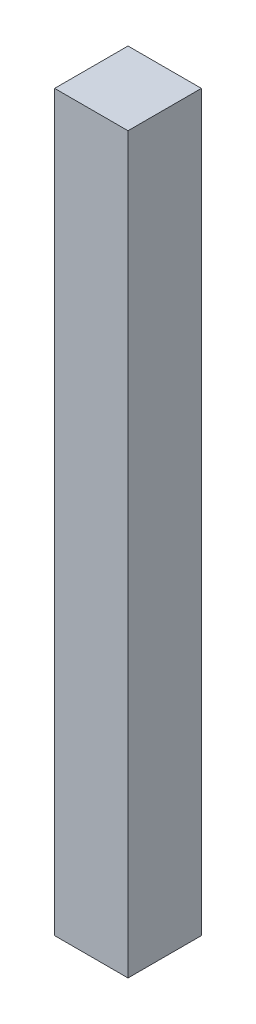
ISO-10303-21;
HEADER;
FILE_DESCRIPTION(('STEP AP214'),'2;1');
FILE_NAME('part.step','',(''),(''),'','','');
FILE_SCHEMA(('AUTOMOTIVE_DESIGN { 1 0 10303 214 1 1 1 1 }'));
ENDSEC;
DATA;
#1=APPLICATION_CONTEXT('core data for automotive mechanical design processes');
#2=APPLICATION_PROTOCOL_DEFINITION('international standard','automotive_design',2000,#1);
#3=PRODUCT_CONTEXT('',#1,'mechanical');
#4=PRODUCT('Part','Part','',(#3));
#5=PRODUCT_RELATED_PRODUCT_CATEGORY('part','',(#4));
#6=PRODUCT_DEFINITION_FORMATION('','',#4);
#7=PRODUCT_DEFINITION_CONTEXT('part definition',#1,'design');
#8=PRODUCT_DEFINITION('design','',#6,#7);
#9=PRODUCT_DEFINITION_SHAPE('','',#8);
#10=(LENGTH_UNIT() NAMED_UNIT(*) SI_UNIT(.MILLI.,.METRE.));
#11=(NAMED_UNIT(*) PLANE_ANGLE_UNIT() SI_UNIT($,.RADIAN.));
#12=(NAMED_UNIT(*) SI_UNIT($,.STERADIAN.) SOLID_ANGLE_UNIT());
#13=UNCERTAINTY_MEASURE_WITH_UNIT(LENGTH_MEASURE(1.E-05),#10,'distance_accuracy_value','');
#14=(GEOMETRIC_REPRESENTATION_CONTEXT(3) GLOBAL_UNCERTAINTY_ASSIGNED_CONTEXT((#13)) GLOBAL_UNIT_ASSIGNED_CONTEXT((#10,
#11,#12)) REPRESENTATION_CONTEXT('',''));
#15=CARTESIAN_POINT('',(0.,0.,0.));
#16=DIRECTION('',(0.,0.,1.));
#17=DIRECTION('',(1.,0.,0.));
#18=AXIS2_PLACEMENT_3D('',#15,#16,#17);
#19=CARTESIAN_POINT('',(10.,200.,10.));
#20=DIRECTION('',(-1.,0.,0.));
#21=DIRECTION('',(0.,0.,1.));
#22=AXIS2_PLACEMENT_3D('',#19,#20,#21);
#23=PLANE('',#22);
#24=DIRECTION('',(0.,0.,-1.));
#25=VECTOR('',#24,1.);
#26=CARTESIAN_POINT('',(10.,0.,10.));
#27=LINE('',#26,#25);
#28=CARTESIAN_POINT('',(10.,0.,10.));
#29=VERTEX_POINT('',#28);
#30=CARTESIAN_POINT('',(10.,0.,-10.));
#31=VERTEX_POINT('',#30);
#32=EDGE_CURVE('E104',#29,#31,#27,.T.);
#33=ORIENTED_EDGE('',*,*,#32,.T.);
#34=DIRECTION('',(0.,-1.,0.));
#35=VECTOR('',#34,1.);
#36=CARTESIAN_POINT('',(10.,200.,-10.));
#37=LINE('',#36,#35);
#38=CARTESIAN_POINT('',(10.,200.,-10.));
#39=VERTEX_POINT('',#38);
#40=EDGE_CURVE('E11',#39,#31,#37,.T.);
#41=ORIENTED_EDGE('',*,*,#40,.F.);
#42=DIRECTION('',(0.,0.,-1.));
#43=VECTOR('',#42,1.);
#44=CARTESIAN_POINT('',(10.,200.,10.));
#45=LINE('',#44,#43);
#46=CARTESIAN_POINT('',(10.,200.,10.));
#47=VERTEX_POINT('',#46);
#48=EDGE_CURVE('E92',#47,#39,#45,.T.);
#49=ORIENTED_EDGE('',*,*,#48,.F.);
#50=DIRECTION('',(0.,-1.,0.));
#51=VECTOR('',#50,1.);
#52=CARTESIAN_POINT('',(10.,200.,10.));
#53=LINE('',#52,#51);
#54=EDGE_CURVE('E100',#47,#29,#53,.T.);
#55=ORIENTED_EDGE('',*,*,#54,.T.);
#56=EDGE_LOOP('',(#33,#41,#49,#55));
#57=FACE_BOUND('',#56,.T.);
#58=ADVANCED_FACE('F41',(#57),#23,.F.);
#59=CARTESIAN_POINT('',(-10.,200.,-10.));
#60=DIRECTION('',(0.,0.,1.));
#61=DIRECTION('',(1.,0.,0.));
#62=AXIS2_PLACEMENT_3D('',#59,#60,#61);
#63=PLANE('',#62);
#64=DIRECTION('',(-1.,0.,0.));
#65=VECTOR('',#64,1.);
#66=CARTESIAN_POINT('',(-10.,0.,-10.));
#67=LINE('',#66,#65);
#68=CARTESIAN_POINT('',(-10.,0.,-10.));
#69=VERTEX_POINT('',#68);
#70=EDGE_CURVE('E96',#31,#69,#67,.T.);
#71=ORIENTED_EDGE('',*,*,#70,.T.);
#72=DIRECTION('',(0.,-1.,0.));
#73=VECTOR('',#72,1.);
#74=CARTESIAN_POINT('',(-10.,200.,-10.));
#75=LINE('',#74,#73);
#76=CARTESIAN_POINT('',(-10.,200.,-10.));
#77=VERTEX_POINT('',#76);
#78=EDGE_CURVE('E49',#77,#69,#75,.T.);
#79=ORIENTED_EDGE('',*,*,#78,.F.);
#80=DIRECTION('',(-1.,0.,0.));
#81=VECTOR('',#80,1.);
#82=CARTESIAN_POINT('',(-10.,200.,-10.));
#83=LINE('',#82,#81);
#84=EDGE_CURVE('E87',#39,#77,#83,.T.);
#85=ORIENTED_EDGE('',*,*,#84,.F.);
#86=ORIENTED_EDGE('',*,*,#40,.T.);
#87=EDGE_LOOP('',(#71,#79,#85,#86));
#88=FACE_BOUND('',#87,.T.);
#89=ADVANCED_FACE('F95',(#88),#63,.F.);
#90=CARTESIAN_POINT('',(-10.,200.,10.));
#91=DIRECTION('',(1.,0.,0.));
#92=DIRECTION('',(0.,0.,-1.));
#93=AXIS2_PLACEMENT_3D('',#90,#91,#92);
#94=PLANE('',#93);
#95=DIRECTION('',(0.,0.,1.));
#96=VECTOR('',#95,1.);
#97=CARTESIAN_POINT('',(-10.,0.,10.));
#98=LINE('',#97,#96);
#99=CARTESIAN_POINT('',(-10.,0.,10.));
#100=VERTEX_POINT('',#99);
#101=EDGE_CURVE('E74',#69,#100,#98,.T.);
#102=ORIENTED_EDGE('',*,*,#101,.T.);
#103=DIRECTION('',(0.,-1.,0.));
#104=VECTOR('',#103,1.);
#105=CARTESIAN_POINT('',(-10.,200.,10.));
#106=LINE('',#105,#104);
#107=CARTESIAN_POINT('',(-10.,200.,10.));
#108=VERTEX_POINT('',#107);
#109=EDGE_CURVE('E97',#108,#100,#106,.T.);
#110=ORIENTED_EDGE('',*,*,#109,.F.);
#111=DIRECTION('',(0.,0.,1.));
#112=VECTOR('',#111,1.);
#113=CARTESIAN_POINT('',(-10.,200.,10.));
#114=LINE('',#113,#112);
#115=EDGE_CURVE('E90',#77,#108,#114,.T.);
#116=ORIENTED_EDGE('',*,*,#115,.F.);
#117=ORIENTED_EDGE('',*,*,#78,.T.);
#118=EDGE_LOOP('',(#102,#110,#116,#117));
#119=FACE_BOUND('',#118,.T.);
#120=ADVANCED_FACE('F98',(#119),#94,.F.);
#121=CARTESIAN_POINT('',(-10.,200.,10.));
#122=DIRECTION('',(0.,0.,-1.));
#123=DIRECTION('',(-1.,0.,0.));
#124=AXIS2_PLACEMENT_3D('',#121,#122,#123);
#125=PLANE('',#124);
#126=DIRECTION('',(1.,0.,0.));
#127=VECTOR('',#126,1.);
#128=CARTESIAN_POINT('',(-10.,0.,10.));
#129=LINE('',#128,#127);
#130=EDGE_CURVE('E80',#100,#29,#129,.T.);
#131=ORIENTED_EDGE('',*,*,#130,.T.);
#132=ORIENTED_EDGE('',*,*,#54,.F.);
#133=DIRECTION('',(1.,0.,0.));
#134=VECTOR('',#133,1.);
#135=CARTESIAN_POINT('',(-10.,200.,10.));
#136=LINE('',#135,#134);
#137=EDGE_CURVE('E57',#108,#47,#136,.T.);
#138=ORIENTED_EDGE('',*,*,#137,.F.);
#139=ORIENTED_EDGE('',*,*,#109,.T.);
#140=EDGE_LOOP('',(#131,#132,#138,#139));
#141=FACE_BOUND('',#140,.T.);
#142=ADVANCED_FACE('F111',(#141),#125,.F.);
#143=CARTESIAN_POINT('',(0.,200.,0.));
#144=DIRECTION('',(0.,-1.,0.));
#145=DIRECTION('',(0.,0.,-1.));
#146=AXIS2_PLACEMENT_3D('',#143,#144,#145);
#147=PLANE('',#146);
#148=ORIENTED_EDGE('',*,*,#48,.T.);
#149=ORIENTED_EDGE('',*,*,#84,.T.);
#150=ORIENTED_EDGE('',*,*,#115,.T.);
#151=ORIENTED_EDGE('',*,*,#137,.T.);
#152=EDGE_LOOP('',(#148,#149,#150,#151));
#153=FACE_BOUND('',#152,.T.);
#154=ADVANCED_FACE('F88',(#153),#147,.F.);
#155=CARTESIAN_POINT('',(0.,0.,0.));
#156=DIRECTION('',(0.,-1.,0.));
#157=DIRECTION('',(0.,0.,-1.));
#158=AXIS2_PLACEMENT_3D('',#155,#156,#157);
#159=PLANE('',#158);
#160=ORIENTED_EDGE('',*,*,#32,.F.);
#161=ORIENTED_EDGE('',*,*,#130,.F.);
#162=ORIENTED_EDGE('',*,*,#101,.F.);
#163=ORIENTED_EDGE('',*,*,#70,.F.);
#164=EDGE_LOOP('',(#160,#161,#162,#163));
#165=FACE_BOUND('',#164,.T.);
#166=ADVANCED_FACE('F114',(#165),#159,.T.);
#167=CLOSED_SHELL('',(#58,#89,#120,#142,#154,#166));
#168=MANIFOLD_SOLID_BREP('B2',#167);
#169=ADVANCED_BREP_SHAPE_REPRESENTATION('',(#18,#168),#14);
#170=SHAPE_DEFINITION_REPRESENTATION(#9,#169);
ENDSEC;
END-ISO-10303-21;
